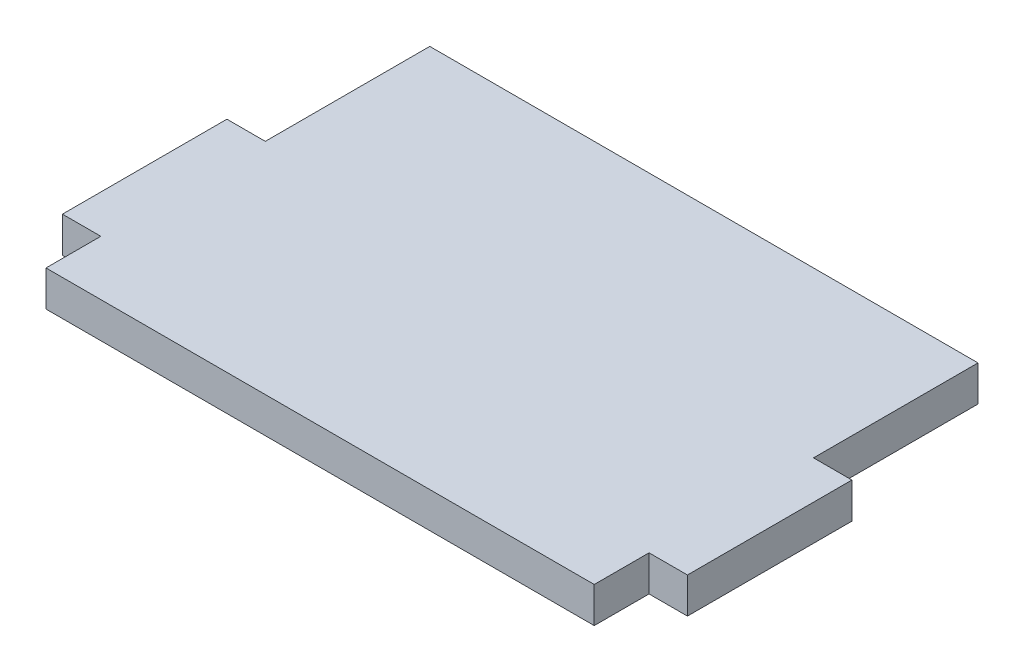
ISO-10303-21;
HEADER;
FILE_DESCRIPTION(('STEP AP214'),'2;1');
FILE_NAME('part.step','',(''),(''),'','','');
FILE_SCHEMA(('AUTOMOTIVE_DESIGN { 1 0 10303 214 1 1 1 1 }'));
ENDSEC;
DATA;
#1=APPLICATION_CONTEXT('core data for automotive mechanical design processes');
#2=APPLICATION_PROTOCOL_DEFINITION('international standard','automotive_design',2000,#1);
#3=PRODUCT_CONTEXT('',#1,'mechanical');
#4=PRODUCT('Part','Part','',(#3));
#5=PRODUCT_RELATED_PRODUCT_CATEGORY('part','',(#4));
#6=PRODUCT_DEFINITION_FORMATION('','',#4);
#7=PRODUCT_DEFINITION_CONTEXT('part definition',#1,'design');
#8=PRODUCT_DEFINITION('design','',#6,#7);
#9=PRODUCT_DEFINITION_SHAPE('','',#8);
#10=(LENGTH_UNIT() NAMED_UNIT(*) SI_UNIT(.MILLI.,.METRE.));
#11=(NAMED_UNIT(*) PLANE_ANGLE_UNIT() SI_UNIT($,.RADIAN.));
#12=(NAMED_UNIT(*) SI_UNIT($,.STERADIAN.) SOLID_ANGLE_UNIT());
#13=UNCERTAINTY_MEASURE_WITH_UNIT(LENGTH_MEASURE(1.E-05),#10,'distance_accuracy_value','');
#14=(GEOMETRIC_REPRESENTATION_CONTEXT(3) GLOBAL_UNCERTAINTY_ASSIGNED_CONTEXT((#13)) GLOBAL_UNIT_ASSIGNED_CONTEXT((#10,
#11,#12)) REPRESENTATION_CONTEXT('',''));
#15=CARTESIAN_POINT('',(0.,0.,0.));
#16=DIRECTION('',(0.,0.,1.));
#17=DIRECTION('',(1.,0.,0.));
#18=AXIS2_PLACEMENT_3D('',#15,#16,#17);
#19=CARTESIAN_POINT('',(10.,1.3,-5.));
#20=DIRECTION('',(-1.,0.,0.));
#21=DIRECTION('',(0.,0.,1.));
#22=AXIS2_PLACEMENT_3D('',#19,#20,#21);
#23=PLANE('',#22);
#24=DIRECTION('',(0.,1.,0.));
#25=VECTOR('',#24,1.);
#26=CARTESIAN_POINT('',(10.,0.,-3.));
#27=LINE('',#26,#25);
#28=CARTESIAN_POINT('',(10.,0.,-3.));
#29=VERTEX_POINT('',#28);
#30=CARTESIAN_POINT('',(10.,1.3,-3.));
#31=VERTEX_POINT('',#30);
#32=EDGE_CURVE('E139',#29,#31,#27,.T.);
#33=ORIENTED_EDGE('',*,*,#32,.F.);
#34=DIRECTION('',(0.,0.,-1.));
#35=VECTOR('',#34,1.);
#36=CARTESIAN_POINT('',(10.,0.,-5.));
#37=LINE('',#36,#35);
#38=CARTESIAN_POINT('',(10.,0.,-9.));
#39=VERTEX_POINT('',#38);
#40=EDGE_CURVE('E134',#29,#39,#37,.T.);
#41=ORIENTED_EDGE('',*,*,#40,.T.);
#42=DIRECTION('',(0.,1.,0.));
#43=VECTOR('',#42,1.);
#44=CARTESIAN_POINT('',(10.,0.,-9.));
#45=LINE('',#44,#43);
#46=CARTESIAN_POINT('',(10.,1.3,-9.));
#47=VERTEX_POINT('',#46);
#48=EDGE_CURVE('E137',#39,#47,#45,.T.);
#49=ORIENTED_EDGE('',*,*,#48,.T.);
#50=DIRECTION('',(0.,0.,-1.));
#51=VECTOR('',#50,1.);
#52=CARTESIAN_POINT('',(10.,1.3,-5.));
#53=LINE('',#52,#51);
#54=EDGE_CURVE('E239',#31,#47,#53,.T.);
#55=ORIENTED_EDGE('',*,*,#54,.F.);
#56=EDGE_LOOP('',(#33,#41,#49,#55));
#57=FACE_BOUND('',#56,.T.);
#58=ADVANCED_FACE('F43',(#57),#23,.F.);
#59=CARTESIAN_POINT('',(-10.,1.3,-5.));
#60=DIRECTION('',(1.,0.,0.));
#61=DIRECTION('',(0.,0.,-1.));
#62=AXIS2_PLACEMENT_3D('',#59,#60,#61);
#63=PLANE('',#62);
#64=DIRECTION('',(0.,1.,0.));
#65=VECTOR('',#64,1.);
#66=CARTESIAN_POINT('',(-10.,0.,2.99999999999999));
#67=LINE('',#66,#65);
#68=CARTESIAN_POINT('',(-10.,0.,2.99999999999999));
#69=VERTEX_POINT('',#68);
#70=CARTESIAN_POINT('',(-10.,1.3,2.99999999999999));
#71=VERTEX_POINT('',#70);
#72=EDGE_CURVE('E145',#69,#71,#67,.T.);
#73=ORIENTED_EDGE('',*,*,#72,.F.);
#74=DIRECTION('',(0.,0.,1.));
#75=VECTOR('',#74,1.);
#76=CARTESIAN_POINT('',(-10.,0.,-5.));
#77=LINE('',#76,#75);
#78=CARTESIAN_POINT('',(-10.,0.,5.));
#79=VERTEX_POINT('',#78);
#80=EDGE_CURVE('E249',#69,#79,#77,.T.);
#81=ORIENTED_EDGE('',*,*,#80,.T.);
#82=DIRECTION('',(0.,-1.,0.));
#83=VECTOR('',#82,1.);
#84=CARTESIAN_POINT('',(-10.,1.3,5.));
#85=LINE('',#84,#83);
#86=CARTESIAN_POINT('',(-10.,1.3,5.));
#87=VERTEX_POINT('',#86);
#88=EDGE_CURVE('E11',#87,#79,#85,.T.);
#89=ORIENTED_EDGE('',*,*,#88,.F.);
#90=DIRECTION('',(0.,0.,1.));
#91=VECTOR('',#90,1.);
#92=CARTESIAN_POINT('',(-10.,1.3,-5.));
#93=LINE('',#92,#91);
#94=EDGE_CURVE('E238',#71,#87,#93,.T.);
#95=ORIENTED_EDGE('',*,*,#94,.F.);
#96=EDGE_LOOP('',(#73,#81,#89,#95));
#97=FACE_BOUND('',#96,.T.);
#98=ADVANCED_FACE('F274',(#97),#63,.F.);
#99=CARTESIAN_POINT('',(10.,0.,5.));
#100=VERTEX_POINT('',#99);
#101=CARTESIAN_POINT('',(10.,0.,3.));
#102=VERTEX_POINT('',#101);
#103=EDGE_CURVE('E144',#100,#102,#37,.T.);
#104=ORIENTED_EDGE('',*,*,#103,.T.);
#105=DIRECTION('',(0.,1.,0.));
#106=VECTOR('',#105,1.);
#107=CARTESIAN_POINT('',(10.,0.,3.));
#108=LINE('',#107,#106);
#109=CARTESIAN_POINT('',(10.,1.3,3.));
#110=VERTEX_POINT('',#109);
#111=EDGE_CURVE('E170',#102,#110,#108,.T.);
#112=ORIENTED_EDGE('',*,*,#111,.T.);
#113=CARTESIAN_POINT('',(10.,1.3,5.));
#114=VERTEX_POINT('',#113);
#115=EDGE_CURVE('E234',#114,#110,#53,.T.);
#116=ORIENTED_EDGE('',*,*,#115,.F.);
#117=DIRECTION('',(0.,-1.,0.));
#118=VECTOR('',#117,1.);
#119=CARTESIAN_POINT('',(10.,1.3,5.));
#120=LINE('',#119,#118);
#121=EDGE_CURVE('E52',#114,#100,#120,.T.);
#122=ORIENTED_EDGE('',*,*,#121,.T.);
#123=EDGE_LOOP('',(#104,#112,#116,#122));
#124=FACE_BOUND('',#123,.T.);
#125=ADVANCED_FACE('F45',(#124),#23,.F.);
#126=CARTESIAN_POINT('',(-10.,0.,-9.));
#127=VERTEX_POINT('',#126);
#128=CARTESIAN_POINT('',(-10.,0.,-3.));
#129=VERTEX_POINT('',#128);
#130=EDGE_CURVE('E161',#127,#129,#77,.T.);
#131=ORIENTED_EDGE('',*,*,#130,.T.);
#132=DIRECTION('',(0.,1.,0.));
#133=VECTOR('',#132,1.);
#134=CARTESIAN_POINT('',(-10.,0.,-3.));
#135=LINE('',#134,#133);
#136=CARTESIAN_POINT('',(-10.,1.3,-3.));
#137=VERTEX_POINT('',#136);
#138=EDGE_CURVE('E214',#129,#137,#135,.T.);
#139=ORIENTED_EDGE('',*,*,#138,.T.);
#140=CARTESIAN_POINT('',(-10.,1.3,-9.));
#141=VERTEX_POINT('',#140);
#142=EDGE_CURVE('E240',#141,#137,#93,.T.);
#143=ORIENTED_EDGE('',*,*,#142,.F.);
#144=DIRECTION('',(0.,1.,0.));
#145=VECTOR('',#144,1.);
#146=CARTESIAN_POINT('',(-10.,0.,-9.));
#147=LINE('',#146,#145);
#148=EDGE_CURVE('E155',#127,#141,#147,.T.);
#149=ORIENTED_EDGE('',*,*,#148,.F.);
#150=EDGE_LOOP('',(#131,#139,#143,#149));
#151=FACE_BOUND('',#150,.T.);
#152=ADVANCED_FACE('F298',(#151),#63,.F.);
#153=CARTESIAN_POINT('',(-10.,1.3,5.));
#154=DIRECTION('',(0.,0.,-1.));
#155=DIRECTION('',(-1.,0.,0.));
#156=AXIS2_PLACEMENT_3D('',#153,#154,#155);
#157=PLANE('',#156);
#158=DIRECTION('',(1.,0.,0.));
#159=VECTOR('',#158,1.);
#160=CARTESIAN_POINT('',(-10.,0.,5.));
#161=LINE('',#160,#159);
#162=EDGE_CURVE('E252',#79,#100,#161,.T.);
#163=ORIENTED_EDGE('',*,*,#162,.T.);
#164=ORIENTED_EDGE('',*,*,#121,.F.);
#165=DIRECTION('',(1.,0.,0.));
#166=VECTOR('',#165,1.);
#167=CARTESIAN_POINT('',(-10.,1.3,5.));
#168=LINE('',#167,#166);
#169=EDGE_CURVE('E244',#87,#114,#168,.T.);
#170=ORIENTED_EDGE('',*,*,#169,.F.);
#171=ORIENTED_EDGE('',*,*,#88,.T.);
#172=EDGE_LOOP('',(#163,#164,#170,#171));
#173=FACE_BOUND('',#172,.T.);
#174=ADVANCED_FACE('F271',(#173),#157,.F.);
#175=CARTESIAN_POINT('',(0.,1.3,0.));
#176=DIRECTION('',(0.,1.,0.));
#177=DIRECTION('',(0.,0.,1.));
#178=AXIS2_PLACEMENT_3D('',#175,#176,#177);
#179=PLANE('',#178);
#180=ORIENTED_EDGE('',*,*,#115,.T.);
#181=DIRECTION('',(1.,0.,0.));
#182=VECTOR('',#181,1.);
#183=CARTESIAN_POINT('',(10.,1.3,3.));
#184=LINE('',#183,#182);
#185=CARTESIAN_POINT('',(11.4,1.3,3.));
#186=VERTEX_POINT('',#185);
#187=EDGE_CURVE('E59',#110,#186,#184,.T.);
#188=ORIENTED_EDGE('',*,*,#187,.T.);
#189=DIRECTION('',(0.,0.,-1.));
#190=VECTOR('',#189,1.);
#191=CARTESIAN_POINT('',(11.4,1.3,-3.));
#192=LINE('',#191,#190);
#193=CARTESIAN_POINT('',(11.4,1.3,-3.));
#194=VERTEX_POINT('',#193);
#195=EDGE_CURVE('E186',#186,#194,#192,.T.);
#196=ORIENTED_EDGE('',*,*,#195,.T.);
#197=DIRECTION('',(-1.,0.,0.));
#198=VECTOR('',#197,1.);
#199=CARTESIAN_POINT('',(10.,1.3,-3.));
#200=LINE('',#199,#198);
#201=EDGE_CURVE('E182',#194,#31,#200,.T.);
#202=ORIENTED_EDGE('',*,*,#201,.T.);
#203=ORIENTED_EDGE('',*,*,#54,.T.);
#204=DIRECTION('',(-1.,0.,0.));
#205=VECTOR('',#204,1.);
#206=CARTESIAN_POINT('',(-10.,1.3,-9.));
#207=LINE('',#206,#205);
#208=EDGE_CURVE('E153',#47,#141,#207,.T.);
#209=ORIENTED_EDGE('',*,*,#208,.T.);
#210=ORIENTED_EDGE('',*,*,#142,.T.);
#211=DIRECTION('',(-1.,0.,0.));
#212=VECTOR('',#211,1.);
#213=CARTESIAN_POINT('',(-10.,1.3,-3.));
#214=LINE('',#213,#212);
#215=CARTESIAN_POINT('',(-11.4,1.3,-3.));
#216=VERTEX_POINT('',#215);
#217=EDGE_CURVE('E67',#137,#216,#214,.T.);
#218=ORIENTED_EDGE('',*,*,#217,.T.);
#219=DIRECTION('',(0.,0.,1.));
#220=VECTOR('',#219,1.);
#221=CARTESIAN_POINT('',(-11.4,1.3,-3.));
#222=LINE('',#221,#220);
#223=CARTESIAN_POINT('',(-11.4,1.3,3.));
#224=VERTEX_POINT('',#223);
#225=EDGE_CURVE('E217',#216,#224,#222,.T.);
#226=ORIENTED_EDGE('',*,*,#225,.T.);
#227=DIRECTION('',(1.,0.,0.));
#228=VECTOR('',#227,1.);
#229=CARTESIAN_POINT('',(-10.,1.3,2.99999999999999));
#230=LINE('',#229,#228);
#231=EDGE_CURVE('E207',#224,#71,#230,.T.);
#232=ORIENTED_EDGE('',*,*,#231,.T.);
#233=ORIENTED_EDGE('',*,*,#94,.T.);
#234=ORIENTED_EDGE('',*,*,#169,.T.);
#235=EDGE_LOOP('',(#180,#188,#196,#202,#203,#209,#210,#218,#226,#232,#233,#234));
#236=FACE_BOUND('',#235,.T.);
#237=ADVANCED_FACE('F268',(#236),#179,.T.);
#238=CARTESIAN_POINT('',(0.,0.,0.));
#239=DIRECTION('',(0.,1.,0.));
#240=DIRECTION('',(0.,0.,1.));
#241=AXIS2_PLACEMENT_3D('',#238,#239,#240);
#242=PLANE('',#241);
#243=ORIENTED_EDGE('',*,*,#103,.F.);
#244=ORIENTED_EDGE('',*,*,#162,.F.);
#245=ORIENTED_EDGE('',*,*,#80,.F.);
#246=DIRECTION('',(1.,0.,0.));
#247=VECTOR('',#246,1.);
#248=CARTESIAN_POINT('',(-10.,0.,2.99999999999999));
#249=LINE('',#248,#247);
#250=CARTESIAN_POINT('',(-11.4,0.,3.));
#251=VERTEX_POINT('',#250);
#252=EDGE_CURVE('E211',#251,#69,#249,.T.);
#253=ORIENTED_EDGE('',*,*,#252,.F.);
#254=DIRECTION('',(0.,0.,1.));
#255=VECTOR('',#254,1.);
#256=CARTESIAN_POINT('',(-11.4,0.,-3.));
#257=LINE('',#256,#255);
#258=CARTESIAN_POINT('',(-11.4,0.,-3.));
#259=VERTEX_POINT('',#258);
#260=EDGE_CURVE('E206',#259,#251,#257,.T.);
#261=ORIENTED_EDGE('',*,*,#260,.F.);
#262=DIRECTION('',(-1.,0.,0.));
#263=VECTOR('',#262,1.);
#264=CARTESIAN_POINT('',(-10.,0.,-3.));
#265=LINE('',#264,#263);
#266=EDGE_CURVE('E202',#129,#259,#265,.T.);
#267=ORIENTED_EDGE('',*,*,#266,.F.);
#268=ORIENTED_EDGE('',*,*,#130,.F.);
#269=DIRECTION('',(-1.,0.,0.));
#270=VECTOR('',#269,1.);
#271=CARTESIAN_POINT('',(-10.,0.,-9.));
#272=LINE('',#271,#270);
#273=EDGE_CURVE('E151',#39,#127,#272,.T.);
#274=ORIENTED_EDGE('',*,*,#273,.F.);
#275=ORIENTED_EDGE('',*,*,#40,.F.);
#276=DIRECTION('',(-1.,0.,0.));
#277=VECTOR('',#276,1.);
#278=CARTESIAN_POINT('',(10.,0.,-3.));
#279=LINE('',#278,#277);
#280=CARTESIAN_POINT('',(11.4,0.,-3.));
#281=VERTEX_POINT('',#280);
#282=EDGE_CURVE('E173',#281,#29,#279,.T.);
#283=ORIENTED_EDGE('',*,*,#282,.F.);
#284=DIRECTION('',(0.,0.,-1.));
#285=VECTOR('',#284,1.);
#286=CARTESIAN_POINT('',(11.4,0.,-3.));
#287=LINE('',#286,#285);
#288=CARTESIAN_POINT('',(11.4,0.,3.));
#289=VERTEX_POINT('',#288);
#290=EDGE_CURVE('E195',#289,#281,#287,.T.);
#291=ORIENTED_EDGE('',*,*,#290,.F.);
#292=DIRECTION('',(1.,0.,0.));
#293=VECTOR('',#292,1.);
#294=CARTESIAN_POINT('',(10.,0.,3.));
#295=LINE('',#294,#293);
#296=EDGE_CURVE('E187',#102,#289,#295,.T.);
#297=ORIENTED_EDGE('',*,*,#296,.F.);
#298=EDGE_LOOP('',(#243,#244,#245,#253,#261,#267,#268,#274,#275,#283,#291,#297));
#299=FACE_BOUND('',#298,.T.);
#300=ADVANCED_FACE('F158',(#299),#242,.F.);
#301=CARTESIAN_POINT('',(-10.,0.,2.99999999999999));
#302=DIRECTION('',(0.,0.,1.));
#303=DIRECTION('',(1.,0.,0.));
#304=AXIS2_PLACEMENT_3D('',#301,#302,#303);
#305=PLANE('',#304);
#306=ORIENTED_EDGE('',*,*,#231,.F.);
#307=DIRECTION('',(0.,1.,0.));
#308=VECTOR('',#307,1.);
#309=CARTESIAN_POINT('',(-11.4,0.,3.));
#310=LINE('',#309,#308);
#311=EDGE_CURVE('E226',#251,#224,#310,.T.);
#312=ORIENTED_EDGE('',*,*,#311,.F.);
#313=ORIENTED_EDGE('',*,*,#252,.T.);
#314=ORIENTED_EDGE('',*,*,#72,.T.);
#315=EDGE_LOOP('',(#306,#312,#313,#314));
#316=FACE_BOUND('',#315,.T.);
#317=ADVANCED_FACE('F311',(#316),#305,.T.);
#318=CARTESIAN_POINT('',(-11.4,0.,-3.));
#319=DIRECTION('',(-1.,0.,0.));
#320=DIRECTION('',(0.,0.,1.));
#321=AXIS2_PLACEMENT_3D('',#318,#319,#320);
#322=PLANE('',#321);
#323=ORIENTED_EDGE('',*,*,#225,.F.);
#324=DIRECTION('',(0.,1.,0.));
#325=VECTOR('',#324,1.);
#326=CARTESIAN_POINT('',(-11.4,0.,-3.));
#327=LINE('',#326,#325);
#328=EDGE_CURVE('E229',#259,#216,#327,.T.);
#329=ORIENTED_EDGE('',*,*,#328,.F.);
#330=ORIENTED_EDGE('',*,*,#260,.T.);
#331=ORIENTED_EDGE('',*,*,#311,.T.);
#332=EDGE_LOOP('',(#323,#329,#330,#331));
#333=FACE_BOUND('',#332,.T.);
#334=ADVANCED_FACE('F315',(#333),#322,.T.);
#335=CARTESIAN_POINT('',(-10.,0.,-3.));
#336=DIRECTION('',(0.,0.,-1.));
#337=DIRECTION('',(-1.,0.,0.));
#338=AXIS2_PLACEMENT_3D('',#335,#336,#337);
#339=PLANE('',#338);
#340=ORIENTED_EDGE('',*,*,#217,.F.);
#341=ORIENTED_EDGE('',*,*,#138,.F.);
#342=ORIENTED_EDGE('',*,*,#266,.T.);
#343=ORIENTED_EDGE('',*,*,#328,.T.);
#344=EDGE_LOOP('',(#340,#341,#342,#343));
#345=FACE_BOUND('',#344,.T.);
#346=ADVANCED_FACE('F291',(#345),#339,.T.);
#347=CARTESIAN_POINT('',(10.,0.,-3.));
#348=DIRECTION('',(0.,0.,-1.));
#349=DIRECTION('',(-1.,0.,0.));
#350=AXIS2_PLACEMENT_3D('',#347,#348,#349);
#351=PLANE('',#350);
#352=ORIENTED_EDGE('',*,*,#201,.F.);
#353=DIRECTION('',(0.,1.,0.));
#354=VECTOR('',#353,1.);
#355=CARTESIAN_POINT('',(11.4,0.,-3.));
#356=LINE('',#355,#354);
#357=EDGE_CURVE('E177',#281,#194,#356,.T.);
#358=ORIENTED_EDGE('',*,*,#357,.F.);
#359=ORIENTED_EDGE('',*,*,#282,.T.);
#360=ORIENTED_EDGE('',*,*,#32,.T.);
#361=EDGE_LOOP('',(#352,#358,#359,#360));
#362=FACE_BOUND('',#361,.T.);
#363=ADVANCED_FACE('F281',(#362),#351,.T.);
#364=CARTESIAN_POINT('',(11.4,0.,-3.));
#365=DIRECTION('',(1.,0.,0.));
#366=DIRECTION('',(0.,0.,-1.));
#367=AXIS2_PLACEMENT_3D('',#364,#365,#366);
#368=PLANE('',#367);
#369=ORIENTED_EDGE('',*,*,#195,.F.);
#370=DIRECTION('',(0.,1.,0.));
#371=VECTOR('',#370,1.);
#372=CARTESIAN_POINT('',(11.4,0.,3.));
#373=LINE('',#372,#371);
#374=EDGE_CURVE('E174',#289,#186,#373,.T.);
#375=ORIENTED_EDGE('',*,*,#374,.F.);
#376=ORIENTED_EDGE('',*,*,#290,.T.);
#377=ORIENTED_EDGE('',*,*,#357,.T.);
#378=EDGE_LOOP('',(#369,#375,#376,#377));
#379=FACE_BOUND('',#378,.T.);
#380=ADVANCED_FACE('F283',(#379),#368,.T.);
#381=CARTESIAN_POINT('',(10.,0.,3.));
#382=DIRECTION('',(0.,0.,1.));
#383=DIRECTION('',(1.,0.,0.));
#384=AXIS2_PLACEMENT_3D('',#381,#382,#383);
#385=PLANE('',#384);
#386=ORIENTED_EDGE('',*,*,#187,.F.);
#387=ORIENTED_EDGE('',*,*,#111,.F.);
#388=ORIENTED_EDGE('',*,*,#296,.T.);
#389=ORIENTED_EDGE('',*,*,#374,.T.);
#390=EDGE_LOOP('',(#386,#387,#388,#389));
#391=FACE_BOUND('',#390,.T.);
#392=ADVANCED_FACE('F265',(#391),#385,.T.);
#393=CARTESIAN_POINT('',(-10.,0.,-9.));
#394=DIRECTION('',(0.,0.,-1.));
#395=DIRECTION('',(-1.,0.,0.));
#396=AXIS2_PLACEMENT_3D('',#393,#394,#395);
#397=PLANE('',#396);
#398=ORIENTED_EDGE('',*,*,#208,.F.);
#399=ORIENTED_EDGE('',*,*,#48,.F.);
#400=ORIENTED_EDGE('',*,*,#273,.T.);
#401=ORIENTED_EDGE('',*,*,#148,.T.);
#402=EDGE_LOOP('',(#398,#399,#400,#401));
#403=FACE_BOUND('',#402,.T.);
#404=ADVANCED_FACE('F149',(#403),#397,.T.);
#405=CLOSED_SHELL('',(#58,#98,#125,#152,#174,#237,#300,#317,#334,#346,#363,#380,#392,#404));
#406=MANIFOLD_SOLID_BREP('B2',#405);
#407=ADVANCED_BREP_SHAPE_REPRESENTATION('',(#18,#406),#14);
#408=SHAPE_DEFINITION_REPRESENTATION(#9,#407);
ENDSEC;
END-ISO-10303-21;
